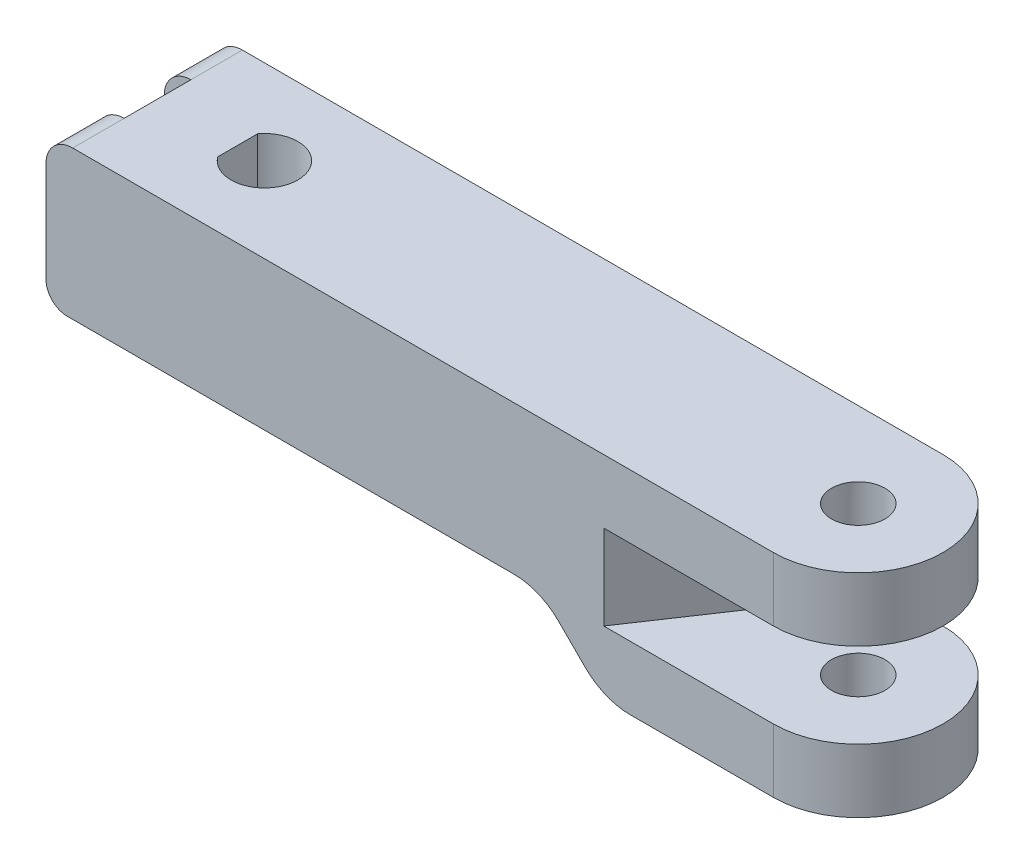
ISO-10303-21;
HEADER;
FILE_DESCRIPTION(('STEP AP214'),'2;1');
FILE_NAME('part.step','',(''),(''),'','','');
FILE_SCHEMA(('AUTOMOTIVE_DESIGN { 1 0 10303 214 1 1 1 1 }'));
ENDSEC;
DATA;
#1=APPLICATION_CONTEXT('core data for automotive mechanical design processes');
#2=APPLICATION_PROTOCOL_DEFINITION('international standard','automotive_design',2000,#1);
#3=PRODUCT_CONTEXT('',#1,'mechanical');
#4=PRODUCT('Part','Part','',(#3));
#5=PRODUCT_RELATED_PRODUCT_CATEGORY('part','',(#4));
#6=PRODUCT_DEFINITION_FORMATION('','',#4);
#7=PRODUCT_DEFINITION_CONTEXT('part definition',#1,'design');
#8=PRODUCT_DEFINITION('design','',#6,#7);
#9=PRODUCT_DEFINITION_SHAPE('','',#8);
#10=(LENGTH_UNIT() NAMED_UNIT(*) SI_UNIT(.MILLI.,.METRE.));
#11=(NAMED_UNIT(*) PLANE_ANGLE_UNIT() SI_UNIT($,.RADIAN.));
#12=(NAMED_UNIT(*) SI_UNIT($,.STERADIAN.) SOLID_ANGLE_UNIT());
#13=UNCERTAINTY_MEASURE_WITH_UNIT(LENGTH_MEASURE(1.E-05),#10,'distance_accuracy_value','');
#14=(GEOMETRIC_REPRESENTATION_CONTEXT(3) GLOBAL_UNCERTAINTY_ASSIGNED_CONTEXT((#13)) GLOBAL_UNIT_ASSIGNED_CONTEXT((#10,
#11,#12)) REPRESENTATION_CONTEXT('',''));
#15=CARTESIAN_POINT('',(0.,0.,0.));
#16=DIRECTION('',(0.,0.,1.));
#17=DIRECTION('',(1.,0.,0.));
#18=AXIS2_PLACEMENT_3D('',#15,#16,#17);
#19=CARTESIAN_POINT('',(0.,0.,-8.85));
#20=DIRECTION('',(0.,0.,1.));
#21=DIRECTION('',(1.,0.,0.));
#22=AXIS2_PLACEMENT_3D('',#19,#20,#21);
#23=PLANE('',#22);
#24=DIRECTION('',(0.,1.,0.));
#25=VECTOR('',#24,1.);
#26=CARTESIAN_POINT('',(2.,-3.1725,-8.85));
#27=LINE('',#26,#25);
#28=CARTESIAN_POINT('',(2.,-3.1725,-8.85));
#29=VERTEX_POINT('',#28);
#30=CARTESIAN_POINT('',(2.,7.9375,-8.85));
#31=VERTEX_POINT('',#30);
#32=EDGE_CURVE('E224',#29,#31,#27,.T.);
#33=ORIENTED_EDGE('',*,*,#32,.T.);
#34=CARTESIAN_POINT('',(2.,5.9375,-8.85));
#35=DIRECTION('',(0.,0.,-1.));
#36=DIRECTION('',(-0.707106781186548,0.707106781186547,0.));
#37=AXIS2_PLACEMENT_3D('',#34,#35,#36);
#38=CIRCLE('',#37,2.);
#39=CARTESIAN_POINT('',(0.,5.9375,-8.85));
#40=VERTEX_POINT('',#39);
#41=EDGE_CURVE('E340',#40,#31,#38,.T.);
#42=ORIENTED_EDGE('',*,*,#41,.F.);
#43=DIRECTION('',(0.,-1.,0.));
#44=VECTOR('',#43,1.);
#45=CARTESIAN_POINT('',(0.,0.,-8.85));
#46=LINE('',#45,#44);
#47=CARTESIAN_POINT('',(0.,-1.5875,-8.85));
#48=VERTEX_POINT('',#47);
#49=EDGE_CURVE('E312',#40,#48,#46,.T.);
#50=ORIENTED_EDGE('',*,*,#49,.T.);
#51=CARTESIAN_POINT('',(1.5875,-1.5875,-8.85));
#52=DIRECTION('',(0.,0.,-1.));
#53=DIRECTION('',(-0.707106781186548,-0.707106781186548,0.));
#54=AXIS2_PLACEMENT_3D('',#51,#52,#53);
#55=CIRCLE('',#54,1.5875);
#56=CARTESIAN_POINT('',(1.5875,-3.175,-8.85));
#57=VERTEX_POINT('',#56);
#58=EDGE_CURVE('E323',#57,#48,#55,.T.);
#59=ORIENTED_EDGE('',*,*,#58,.F.);
#60=DIRECTION('',(-1.,0.,0.));
#61=VECTOR('',#60,1.);
#62=CARTESIAN_POINT('',(0.,-3.175,-8.85));
#63=LINE('',#62,#61);
#64=CARTESIAN_POINT('',(10.,-3.175,-8.85));
#65=VERTEX_POINT('',#64);
#66=EDGE_CURVE('E469',#65,#57,#63,.T.);
#67=ORIENTED_EDGE('',*,*,#66,.F.);
#68=DIRECTION('',(0.,1.,0.));
#69=VECTOR('',#68,1.);
#70=CARTESIAN_POINT('',(10.,0.,-8.85));
#71=LINE('',#70,#69);
#72=CARTESIAN_POINT('',(10.,-3.1725,-8.85));
#73=VERTEX_POINT('',#72);
#74=EDGE_CURVE('E11',#65,#73,#71,.T.);
#75=ORIENTED_EDGE('',*,*,#74,.T.);
#76=DIRECTION('',(1.,0.,0.));
#77=VECTOR('',#76,1.);
#78=CARTESIAN_POINT('',(0.,-3.1725,-8.85));
#79=LINE('',#78,#77);
#80=EDGE_CURVE('E63',#29,#73,#79,.T.);
#81=ORIENTED_EDGE('',*,*,#80,.F.);
#82=EDGE_LOOP('',(#33,#42,#50,#59,#67,#75,#81));
#83=FACE_BOUND('',#82,.T.);
#84=ADVANCED_FACE('F49',(#83),#23,.T.);
#85=CARTESIAN_POINT('',(10.,0.,-6.35));
#86=DIRECTION('',(0.,-1.,0.));
#87=DIRECTION('',(0.,0.,-1.));
#88=AXIS2_PLACEMENT_3D('',#85,#86,#87);
#89=CYLINDRICAL_SURFACE('',#88,2.5);
#90=DIRECTION('',(0.,1.,0.));
#91=VECTOR('',#90,1.);
#92=CARTESIAN_POINT('',(10.,0.,-3.85));
#93=LINE('',#92,#91);
#94=CARTESIAN_POINT('',(10.,-3.175,-3.85));
#95=VERTEX_POINT('',#94);
#96=CARTESIAN_POINT('',(10.,-3.1725,-3.85));
#97=VERTEX_POINT('',#96);
#98=EDGE_CURVE('E57',#95,#97,#93,.T.);
#99=ORIENTED_EDGE('',*,*,#98,.T.);
#100=CARTESIAN_POINT('',(10.,-3.1725,-6.35));
#101=DIRECTION('',(0.,1.,0.));
#102=DIRECTION('',(0.,0.,1.));
#103=AXIS2_PLACEMENT_3D('',#100,#101,#102);
#104=CIRCLE('',#103,2.5);
#105=CARTESIAN_POINT('',(8.,-3.1725,-4.85));
#106=VERTEX_POINT('',#105);
#107=EDGE_CURVE('E218',#106,#97,#104,.T.);
#108=ORIENTED_EDGE('',*,*,#107,.F.);
#109=DIRECTION('',(0.,1.,0.));
#110=VECTOR('',#109,1.);
#111=CARTESIAN_POINT('',(8.,-3.1725,-4.85));
#112=LINE('',#111,#110);
#113=CARTESIAN_POINT('',(8.,7.9375,-4.85));
#114=VERTEX_POINT('',#113);
#115=EDGE_CURVE('E227',#106,#114,#112,.T.);
#116=ORIENTED_EDGE('',*,*,#115,.T.);
#117=CARTESIAN_POINT('',(10.,7.9375,-6.35));
#118=DIRECTION('',(0.,1.,0.));
#119=DIRECTION('',(0.,0.,-1.));
#120=AXIS2_PLACEMENT_3D('',#117,#118,#119);
#121=CIRCLE('',#120,2.5);
#122=CARTESIAN_POINT('',(8.,7.9375,-7.85));
#123=VERTEX_POINT('',#122);
#124=EDGE_CURVE('E374',#114,#123,#121,.T.);
#125=ORIENTED_EDGE('',*,*,#124,.T.);
#126=DIRECTION('',(0.,1.,0.));
#127=VECTOR('',#126,1.);
#128=CARTESIAN_POINT('',(8.,-3.1725,-7.85));
#129=LINE('',#128,#127);
#130=CARTESIAN_POINT('',(8.,-3.1725,-7.85));
#131=VERTEX_POINT('',#130);
#132=EDGE_CURVE('E235',#131,#123,#129,.T.);
#133=ORIENTED_EDGE('',*,*,#132,.F.);
#134=EDGE_CURVE('E220',#73,#131,#104,.T.);
#135=ORIENTED_EDGE('',*,*,#134,.F.);
#136=ORIENTED_EDGE('',*,*,#74,.F.);
#137=CARTESIAN_POINT('',(10.,-3.175,-6.35));
#138=DIRECTION('',(0.,1.,0.));
#139=DIRECTION('',(0.,0.,-1.));
#140=AXIS2_PLACEMENT_3D('',#137,#138,#139);
#141=CIRCLE('',#140,2.5);
#142=EDGE_CURVE('E465',#95,#65,#141,.T.);
#143=ORIENTED_EDGE('',*,*,#142,.F.);
#144=EDGE_LOOP('',(#99,#108,#116,#125,#133,#135,#136,#143));
#145=FACE_BOUND('',#144,.T.);
#146=ADVANCED_FACE('F239',(#145),#89,.F.);
#147=CARTESIAN_POINT('',(10.,0.,-3.85));
#148=DIRECTION('',(0.,0.,-1.));
#149=DIRECTION('',(-1.,0.,0.));
#150=AXIS2_PLACEMENT_3D('',#147,#148,#149);
#151=PLANE('',#150);
#152=DIRECTION('',(0.,1.,0.));
#153=VECTOR('',#152,1.);
#154=CARTESIAN_POINT('',(2.,-3.1725,-3.85));
#155=LINE('',#154,#153);
#156=CARTESIAN_POINT('',(2.,-3.1725,-3.85));
#157=VERTEX_POINT('',#156);
#158=CARTESIAN_POINT('',(2.,7.9375,-3.85));
#159=VERTEX_POINT('',#158);
#160=EDGE_CURVE('E236',#157,#159,#155,.T.);
#161=ORIENTED_EDGE('',*,*,#160,.F.);
#162=DIRECTION('',(-1.,0.,0.));
#163=VECTOR('',#162,1.);
#164=CARTESIAN_POINT('',(0.,-3.1725,-3.85));
#165=LINE('',#164,#163);
#166=EDGE_CURVE('E242',#97,#157,#165,.T.);
#167=ORIENTED_EDGE('',*,*,#166,.F.);
#168=ORIENTED_EDGE('',*,*,#98,.F.);
#169=DIRECTION('',(1.,0.,0.));
#170=VECTOR('',#169,1.);
#171=CARTESIAN_POINT('',(10.,-3.175,-3.85));
#172=LINE('',#171,#170);
#173=CARTESIAN_POINT('',(1.5875,-3.175,-3.85));
#174=VERTEX_POINT('',#173);
#175=EDGE_CURVE('E397',#174,#95,#172,.T.);
#176=ORIENTED_EDGE('',*,*,#175,.F.);
#177=CARTESIAN_POINT('',(1.5875,-1.5875,-3.85));
#178=DIRECTION('',(0.,0.,1.));
#179=DIRECTION('',(-0.707106781186547,-0.707106781186548,0.));
#180=AXIS2_PLACEMENT_3D('',#177,#178,#179);
#181=CIRCLE('',#180,1.5875);
#182=CARTESIAN_POINT('',(0.,-1.5875,-3.85));
#183=VERTEX_POINT('',#182);
#184=EDGE_CURVE('E363',#183,#174,#181,.T.);
#185=ORIENTED_EDGE('',*,*,#184,.F.);
#186=DIRECTION('',(0.,1.,0.));
#187=VECTOR('',#186,1.);
#188=CARTESIAN_POINT('',(0.,0.,-3.85));
#189=LINE('',#188,#187);
#190=CARTESIAN_POINT('',(0.,5.9375,-3.85));
#191=VERTEX_POINT('',#190);
#192=EDGE_CURVE('E330',#183,#191,#189,.T.);
#193=ORIENTED_EDGE('',*,*,#192,.T.);
#194=CARTESIAN_POINT('',(2.,5.9375,-3.85));
#195=DIRECTION('',(0.,0.,1.));
#196=DIRECTION('',(-0.707106781186548,0.707106781186547,0.));
#197=AXIS2_PLACEMENT_3D('',#194,#195,#196);
#198=CIRCLE('',#197,2.);
#199=EDGE_CURVE('E344',#159,#191,#198,.T.);
#200=ORIENTED_EDGE('',*,*,#199,.F.);
#201=EDGE_LOOP('',(#161,#167,#168,#176,#185,#193,#200));
#202=FACE_BOUND('',#201,.T.);
#203=ADVANCED_FACE('F487',(#202),#151,.T.);
#204=CARTESIAN_POINT('',(0.,0.,-3.85));
#205=DIRECTION('',(-1.,0.,0.));
#206=DIRECTION('',(0.,0.,1.));
#207=AXIS2_PLACEMENT_3D('',#204,#205,#206);
#208=PLANE('',#207);
#209=DIRECTION('',(0.,0.,1.));
#210=VECTOR('',#209,1.);
#211=CARTESIAN_POINT('',(0.,5.9375,-5.1));
#212=LINE('',#211,#210);
#213=CARTESIAN_POINT('',(0.,5.9375,0.));
#214=VERTEX_POINT('',#213);
#215=EDGE_CURVE('E443',#191,#214,#212,.T.);
#216=ORIENTED_EDGE('',*,*,#215,.F.);
#217=ORIENTED_EDGE('',*,*,#192,.F.);
#218=DIRECTION('',(0.,0.,-1.));
#219=VECTOR('',#218,1.);
#220=CARTESIAN_POINT('',(0.,-1.5875,-5.1));
#221=LINE('',#220,#219);
#222=CARTESIAN_POINT('',(0.,-1.5875,0.));
#223=VERTEX_POINT('',#222);
#224=EDGE_CURVE('E315',#223,#183,#221,.T.);
#225=ORIENTED_EDGE('',*,*,#224,.F.);
#226=DIRECTION('',(0.,1.,0.));
#227=VECTOR('',#226,1.);
#228=CARTESIAN_POINT('',(0.,0.,0.));
#229=LINE('',#228,#227);
#230=EDGE_CURVE('E405',#223,#214,#229,.T.);
#231=ORIENTED_EDGE('',*,*,#230,.T.);
#232=EDGE_LOOP('',(#216,#217,#225,#231));
#233=FACE_BOUND('',#232,.T.);
#234=ADVANCED_FACE('F490',(#233),#208,.T.);
#235=CARTESIAN_POINT('',(1.5875,-1.5875,-5.1));
#236=DIRECTION('',(0.,0.,1.));
#237=DIRECTION('',(-0.707106781186547,-0.707106781186548,0.));
#238=AXIS2_PLACEMENT_3D('',#235,#236,#237);
#239=CYLINDRICAL_SURFACE('',#238,1.5875);
#240=CARTESIAN_POINT('',(1.5875,-1.5875,0.));
#241=DIRECTION('',(0.,0.,-1.));
#242=DIRECTION('',(-0.707106781186547,-0.707106781186548,0.));
#243=AXIS2_PLACEMENT_3D('',#240,#241,#242);
#244=CIRCLE('',#243,1.5875);
#245=CARTESIAN_POINT('',(1.5875,-3.175,0.));
#246=VERTEX_POINT('',#245);
#247=EDGE_CURVE('E409',#246,#223,#244,.T.);
#248=ORIENTED_EDGE('',*,*,#247,.T.);
#249=ORIENTED_EDGE('',*,*,#224,.T.);
#250=ORIENTED_EDGE('',*,*,#184,.T.);
#251=DIRECTION('',(0.,0.,1.));
#252=VECTOR('',#251,1.);
#253=CARTESIAN_POINT('',(1.5875,-3.175,-5.1));
#254=LINE('',#253,#252);
#255=EDGE_CURVE('E394',#174,#246,#254,.T.);
#256=ORIENTED_EDGE('',*,*,#255,.T.);
#257=EDGE_LOOP('',(#248,#249,#250,#256));
#258=FACE_BOUND('',#257,.T.);
#259=ADVANCED_FACE('F518',(#258),#239,.T.);
#260=CARTESIAN_POINT('',(0.,0.,-12.7));
#261=DIRECTION('',(-1.,0.,0.));
#262=DIRECTION('',(0.,0.,1.));
#263=AXIS2_PLACEMENT_3D('',#260,#261,#262);
#264=PLANE('',#263);
#265=DIRECTION('',(0.,0.,1.));
#266=VECTOR('',#265,1.);
#267=CARTESIAN_POINT('',(0.,5.9375,-9.525));
#268=LINE('',#267,#266);
#269=CARTESIAN_POINT('',(0.,5.9375,-12.7));
#270=VERTEX_POINT('',#269);
#271=EDGE_CURVE('E345',#270,#40,#268,.T.);
#272=ORIENTED_EDGE('',*,*,#271,.F.);
#273=DIRECTION('',(0.,1.,0.));
#274=VECTOR('',#273,1.);
#275=CARTESIAN_POINT('',(0.,0.,-12.7));
#276=LINE('',#275,#274);
#277=CARTESIAN_POINT('',(0.,-1.5875,-12.7));
#278=VERTEX_POINT('',#277);
#279=EDGE_CURVE('E281',#278,#270,#276,.T.);
#280=ORIENTED_EDGE('',*,*,#279,.F.);
#281=DIRECTION('',(0.,0.,-1.));
#282=VECTOR('',#281,1.);
#283=CARTESIAN_POINT('',(0.,-1.5875,-9.525));
#284=LINE('',#283,#282);
#285=EDGE_CURVE('E316',#48,#278,#284,.T.);
#286=ORIENTED_EDGE('',*,*,#285,.F.);
#287=ORIENTED_EDGE('',*,*,#49,.F.);
#288=EDGE_LOOP('',(#272,#280,#286,#287));
#289=FACE_BOUND('',#288,.T.);
#290=ADVANCED_FACE('F533',(#289),#264,.T.);
#291=CARTESIAN_POINT('',(1.5875,-1.5875,-9.525));
#292=DIRECTION('',(0.,0.,1.));
#293=DIRECTION('',(-0.707106781186548,-0.707106781186548,0.));
#294=AXIS2_PLACEMENT_3D('',#291,#292,#293);
#295=CYLINDRICAL_SURFACE('',#294,1.5875);
#296=CARTESIAN_POINT('',(1.5875,-1.5875,-12.7));
#297=DIRECTION('',(0.,0.,1.));
#298=DIRECTION('',(-0.707106781186548,-0.707106781186548,0.));
#299=AXIS2_PLACEMENT_3D('',#296,#297,#298);
#300=CIRCLE('',#299,1.5875);
#301=CARTESIAN_POINT('',(1.5875,-3.175,-12.7));
#302=VERTEX_POINT('',#301);
#303=EDGE_CURVE('E286',#278,#302,#300,.T.);
#304=ORIENTED_EDGE('',*,*,#303,.T.);
#305=DIRECTION('',(0.,0.,1.));
#306=VECTOR('',#305,1.);
#307=CARTESIAN_POINT('',(1.5875,-3.175,-9.525));
#308=LINE('',#307,#306);
#309=EDGE_CURVE('E324',#302,#57,#308,.T.);
#310=ORIENTED_EDGE('',*,*,#309,.T.);
#311=ORIENTED_EDGE('',*,*,#58,.T.);
#312=ORIENTED_EDGE('',*,*,#285,.T.);
#313=EDGE_LOOP('',(#304,#310,#311,#312));
#314=FACE_BOUND('',#313,.T.);
#315=ADVANCED_FACE('F535',(#314),#295,.T.);
#316=CARTESIAN_POINT('',(39.36875,-5.55625,-9.525));
#317=DIRECTION('',(-0.707106781186548,-0.707106781186548,0.));
#318=DIRECTION('',(0.,0.,1.));
#319=AXIS2_PLACEMENT_3D('',#316,#317,#318);
#320=PLANE('',#319);
#321=DIRECTION('',(0.,0.,1.));
#322=VECTOR('',#321,1.);
#323=CARTESIAN_POINT('',(38.382403954599,-4.56990395459907,-7.9375));
#324=LINE('',#323,#322);
#325=CARTESIAN_POINT('',(38.382403954599,-4.56990395459907,-12.7));
#326=VERTEX_POINT('',#325);
#327=CARTESIAN_POINT('',(38.382403954599,-4.56990395459907,0.));
#328=VERTEX_POINT('',#327);
#329=EDGE_CURVE('E385',#326,#328,#324,.T.);
#330=ORIENTED_EDGE('',*,*,#329,.F.);
#331=DIRECTION('',(0.707106781186548,-0.707106781186548,0.));
#332=VECTOR('',#331,1.);
#333=CARTESIAN_POINT('',(43.3375,-9.525,-12.7));
#334=LINE('',#333,#332);
#335=CARTESIAN_POINT('',(40.3550960454009,-6.54259604540093,-12.7));
#336=VERTEX_POINT('',#335);
#337=EDGE_CURVE('E287',#326,#336,#334,.T.);
#338=ORIENTED_EDGE('',*,*,#337,.T.);
#339=DIRECTION('',(0.,0.,-1.));
#340=VECTOR('',#339,1.);
#341=CARTESIAN_POINT('',(40.3550960454009,-6.54259604540093,-7.9375));
#342=LINE('',#341,#340);
#343=CARTESIAN_POINT('',(40.3550960454009,-6.54259604540093,0.));
#344=VERTEX_POINT('',#343);
#345=EDGE_CURVE('E320',#344,#336,#342,.T.);
#346=ORIENTED_EDGE('',*,*,#345,.F.);
#347=DIRECTION('',(-0.707106781186548,0.707106781186548,0.));
#348=VECTOR('',#347,1.);
#349=CARTESIAN_POINT('',(28.1375,5.675,0.));
#350=LINE('',#349,#348);
#351=EDGE_CURVE('E421',#344,#328,#350,.T.);
#352=ORIENTED_EDGE('',*,*,#351,.T.);
#353=EDGE_LOOP('',(#330,#338,#346,#352));
#354=FACE_BOUND('',#353,.T.);
#355=ADVANCED_FACE('F546',(#354),#320,.T.);
#356=CARTESIAN_POINT('',(43.7226920908018,-3.175,-7.9375));
#357=DIRECTION('',(0.,0.,1.));
#358=DIRECTION('',(-0.38268343236509,-0.923879532511287,0.));
#359=AXIS2_PLACEMENT_3D('',#356,#357,#358);
#360=CYLINDRICAL_SURFACE('',#359,4.7625);
#361=CARTESIAN_POINT('',(43.7226920908018,-3.175,-12.7));
#362=DIRECTION('',(0.,0.,1.));
#363=DIRECTION('',(-0.38268343236509,-0.923879532511287,0.));
#364=AXIS2_PLACEMENT_3D('',#361,#362,#363);
#365=CIRCLE('',#364,4.7625);
#366=CARTESIAN_POINT('',(43.7226920908018,-7.9375,-12.7));
#367=VERTEX_POINT('',#366);
#368=EDGE_CURVE('E292',#336,#367,#365,.T.);
#369=ORIENTED_EDGE('',*,*,#368,.T.);
#370=DIRECTION('',(0.,0.,1.));
#371=VECTOR('',#370,1.);
#372=CARTESIAN_POINT('',(43.7226920908018,-7.9375,-7.9375));
#373=LINE('',#372,#371);
#374=CARTESIAN_POINT('',(43.7226920908018,-7.9375,0.));
#375=VERTEX_POINT('',#374);
#376=EDGE_CURVE('E455',#367,#375,#373,.T.);
#377=ORIENTED_EDGE('',*,*,#376,.T.);
#378=CARTESIAN_POINT('',(43.7226920908018,-3.175,0.));
#379=DIRECTION('',(0.,0.,-1.));
#380=DIRECTION('',(-0.38268343236509,-0.923879532511287,0.));
#381=AXIS2_PLACEMENT_3D('',#378,#379,#380);
#382=CIRCLE('',#381,4.7625);
#383=EDGE_CURVE('E425',#375,#344,#382,.T.);
#384=ORIENTED_EDGE('',*,*,#383,.T.);
#385=ORIENTED_EDGE('',*,*,#345,.T.);
#386=EDGE_LOOP('',(#369,#377,#384,#385));
#387=FACE_BOUND('',#386,.T.);
#388=ADVANCED_FACE('F548',(#387),#360,.T.);
#389=CARTESIAN_POINT('',(30.4,-3.175,-6.35));
#390=DIRECTION('',(0.,1.,0.));
#391=DIRECTION('',(0.,0.,1.));
#392=AXIS2_PLACEMENT_3D('',#389,#390,#391);
#393=PLANE('',#392);
#394=DIRECTION('',(0.,0.,-1.));
#395=VECTOR('',#394,1.);
#396=CARTESIAN_POINT('',(35.0148079091981,-3.175,-7.9375));
#397=LINE('',#396,#395);
#398=CARTESIAN_POINT('',(35.0148079091981,-3.175,0.));
#399=VERTEX_POINT('',#398);
#400=CARTESIAN_POINT('',(35.0148079091981,-3.175,-12.7));
#401=VERTEX_POINT('',#400);
#402=EDGE_CURVE('E382',#399,#401,#397,.T.);
#403=ORIENTED_EDGE('',*,*,#402,.F.);
#404=DIRECTION('',(-1.,0.,0.));
#405=VECTOR('',#404,1.);
#406=CARTESIAN_POINT('',(0.,-3.175,0.));
#407=LINE('',#406,#405);
#408=EDGE_CURVE('E413',#399,#246,#407,.T.);
#409=ORIENTED_EDGE('',*,*,#408,.T.);
#410=ORIENTED_EDGE('',*,*,#255,.F.);
#411=ORIENTED_EDGE('',*,*,#175,.T.);
#412=ORIENTED_EDGE('',*,*,#142,.T.);
#413=ORIENTED_EDGE('',*,*,#66,.T.);
#414=ORIENTED_EDGE('',*,*,#309,.F.);
#415=DIRECTION('',(1.,0.,0.));
#416=VECTOR('',#415,1.);
#417=CARTESIAN_POINT('',(60.8,-3.175,-12.7));
#418=LINE('',#417,#416);
#419=EDGE_CURVE('E304',#302,#401,#418,.T.);
#420=ORIENTED_EDGE('',*,*,#419,.T.);
#421=EDGE_LOOP('',(#403,#409,#410,#411,#412,#413,#414,#420));
#422=FACE_BOUND('',#421,.T.);
#423=ADVANCED_FACE('F514',(#422),#393,.F.);
#424=CARTESIAN_POINT('',(35.0148079091981,-7.9375,-7.9375));
#425=DIRECTION('',(0.,0.,1.));
#426=DIRECTION('',(0.38268343236509,0.923879532511287,0.));
#427=AXIS2_PLACEMENT_3D('',#424,#425,#426);
#428=CYLINDRICAL_SURFACE('',#427,4.7625);
#429=CARTESIAN_POINT('',(35.0148079091981,-7.9375,0.));
#430=DIRECTION('',(0.,0.,1.));
#431=DIRECTION('',(0.38268343236509,0.923879532511287,0.));
#432=AXIS2_PLACEMENT_3D('',#429,#430,#431);
#433=CIRCLE('',#432,4.7625);
#434=EDGE_CURVE('E417',#328,#399,#433,.T.);
#435=ORIENTED_EDGE('',*,*,#434,.T.);
#436=ORIENTED_EDGE('',*,*,#402,.T.);
#437=CARTESIAN_POINT('',(35.0148079091981,-7.9375,-12.7));
#438=DIRECTION('',(0.,0.,-1.));
#439=DIRECTION('',(0.38268343236509,0.923879532511287,0.));
#440=AXIS2_PLACEMENT_3D('',#437,#438,#439);
#441=CIRCLE('',#440,4.7625);
#442=EDGE_CURVE('E291',#401,#326,#441,.T.);
#443=ORIENTED_EDGE('',*,*,#442,.T.);
#444=ORIENTED_EDGE('',*,*,#329,.T.);
#445=EDGE_LOOP('',(#435,#436,#443,#444));
#446=FACE_BOUND('',#445,.T.);
#447=ADVANCED_FACE('F540',(#446),#428,.F.);
#448=CARTESIAN_POINT('',(54.45,0.,-6.35));
#449=DIRECTION('',(0.,-1.,0.));
#450=DIRECTION('',(0.707106781186548,0.,0.707106781186548));
#451=AXIS2_PLACEMENT_3D('',#448,#449,#450);
#452=CYLINDRICAL_SURFACE('',#451,6.35);
#453=CARTESIAN_POINT('',(54.45,7.9375,-6.35));
#454=DIRECTION('',(0.,-1.,0.));
#455=DIRECTION('',(0.707106781186548,0.,-0.707106781186548));
#456=AXIS2_PLACEMENT_3D('',#453,#454,#455);
#457=CIRCLE('',#456,6.35);
#458=CARTESIAN_POINT('',(54.45,7.9375,-12.7));
#459=VERTEX_POINT('',#458);
#460=CARTESIAN_POINT('',(54.45,7.9375,0.));
#461=VERTEX_POINT('',#460);
#462=EDGE_CURVE('E367',#459,#461,#457,.T.);
#463=ORIENTED_EDGE('',*,*,#462,.T.);
#464=DIRECTION('',(0.,-1.,0.));
#465=VECTOR('',#464,1.);
#466=CARTESIAN_POINT('',(54.45,0.,0.));
#467=LINE('',#466,#465);
#468=CARTESIAN_POINT('',(54.45,3.175,0.));
#469=VERTEX_POINT('',#468);
#470=EDGE_CURVE('E265',#461,#469,#467,.T.);
#471=ORIENTED_EDGE('',*,*,#470,.T.);
#472=CARTESIAN_POINT('',(54.45,3.175,-6.35));
#473=DIRECTION('',(0.,1.,0.));
#474=DIRECTION('',(0.707106781186548,0.,-0.707106781186548));
#475=AXIS2_PLACEMENT_3D('',#472,#473,#474);
#476=CIRCLE('',#475,6.35);
#477=CARTESIAN_POINT('',(54.45,3.175,-12.7));
#478=VERTEX_POINT('',#477);
#479=EDGE_CURVE('E386',#469,#478,#476,.T.);
#480=ORIENTED_EDGE('',*,*,#479,.T.);
#481=DIRECTION('',(0.,1.,0.));
#482=VECTOR('',#481,1.);
#483=CARTESIAN_POINT('',(54.45,0.,-12.7));
#484=LINE('',#483,#482);
#485=EDGE_CURVE('E280',#478,#459,#484,.T.);
#486=ORIENTED_EDGE('',*,*,#485,.T.);
#487=EDGE_LOOP('',(#463,#471,#480,#486));
#488=FACE_BOUND('',#487,.T.);
#489=ADVANCED_FACE('F523',(#488),#452,.T.);
#490=CARTESIAN_POINT('',(41.75,3.175,0.));
#491=DIRECTION('',(0.,1.,0.));
#492=DIRECTION('',(1.,0.,0.));
#493=AXIS2_PLACEMENT_3D('',#490,#491,#492);
#494=PLANE('',#493);
#495=CARTESIAN_POINT('',(54.45,3.175,-6.35));
#496=DIRECTION('',(0.,1.,0.));
#497=DIRECTION('',(1.,0.,0.));
#498=AXIS2_PLACEMENT_3D('',#495,#496,#497);
#499=CIRCLE('',#498,2.);
#500=CARTESIAN_POINT('',(52.45,3.175,-6.35));
#501=VERTEX_POINT('',#500);
#502=EDGE_CURVE('E446',#501,#501,#499,.T.);
#503=ORIENTED_EDGE('',*,*,#502,.T.);
#504=EDGE_LOOP('',(#503));
#505=FACE_BOUND('',#504,.T.);
#506=DIRECTION('',(0.557337622445935,0.,-0.830285959538226));
#507=VECTOR('',#506,1.);
#508=CARTESIAN_POINT('',(41.75,3.175,0.));
#509=LINE('',#508,#507);
#510=CARTESIAN_POINT('',(41.75,3.175,0.));
#511=VERTEX_POINT('',#510);
#512=CARTESIAN_POINT('',(50.275,3.175,-12.7));
#513=VERTEX_POINT('',#512);
#514=EDGE_CURVE('E279',#511,#513,#509,.T.);
#515=ORIENTED_EDGE('',*,*,#514,.T.);
#516=DIRECTION('',(-1.,0.,0.));
#517=VECTOR('',#516,1.);
#518=CARTESIAN_POINT('',(51.275,3.175,-12.7));
#519=LINE('',#518,#517);
#520=EDGE_CURVE('E275',#478,#513,#519,.T.);
#521=ORIENTED_EDGE('',*,*,#520,.F.);
#522=ORIENTED_EDGE('',*,*,#479,.F.);
#523=DIRECTION('',(1.,0.,0.));
#524=VECTOR('',#523,1.);
#525=CARTESIAN_POINT('',(20.875,3.175,0.));
#526=LINE('',#525,#524);
#527=EDGE_CURVE('E270',#511,#469,#526,.T.);
#528=ORIENTED_EDGE('',*,*,#527,.F.);
#529=EDGE_LOOP('',(#515,#521,#522,#528));
#530=FACE_BOUND('',#529,.T.);
#531=ADVANCED_FACE('F565',(#505,#530),#494,.F.);
#532=CARTESIAN_POINT('',(54.45,0.,-6.35));
#533=DIRECTION('',(0.,-1.,0.));
#534=DIRECTION('',(0.707106781186548,0.,0.707106781186548));
#535=AXIS2_PLACEMENT_3D('',#532,#533,#534);
#536=CYLINDRICAL_SURFACE('',#535,6.35);
#537=CARTESIAN_POINT('',(54.45,-3.175,-6.35));
#538=DIRECTION('',(0.,-1.,0.));
#539=DIRECTION('',(0.707106781186548,0.,0.707106781186548));
#540=AXIS2_PLACEMENT_3D('',#537,#538,#539);
#541=CIRCLE('',#540,6.35);
#542=CARTESIAN_POINT('',(54.45,-3.175,-12.7));
#543=VERTEX_POINT('',#542);
#544=CARTESIAN_POINT('',(54.45,-3.175,0.));
#545=VERTEX_POINT('',#544);
#546=EDGE_CURVE('E389',#543,#545,#541,.T.);
#547=ORIENTED_EDGE('',*,*,#546,.T.);
#548=DIRECTION('',(0.,-1.,0.));
#549=VECTOR('',#548,1.);
#550=CARTESIAN_POINT('',(54.45,0.,0.));
#551=LINE('',#550,#549);
#552=CARTESIAN_POINT('',(54.45,-7.9375,0.));
#553=VERTEX_POINT('',#552);
#554=EDGE_CURVE('E433',#545,#553,#551,.T.);
#555=ORIENTED_EDGE('',*,*,#554,.T.);
#556=CARTESIAN_POINT('',(54.45,-7.9375,-6.35));
#557=DIRECTION('',(0.,1.,0.));
#558=DIRECTION('',(0.707106781186548,0.,-0.707106781186548));
#559=AXIS2_PLACEMENT_3D('',#556,#557,#558);
#560=CIRCLE('',#559,6.35);
#561=CARTESIAN_POINT('',(54.45,-7.9375,-12.7));
#562=VERTEX_POINT('',#561);
#563=EDGE_CURVE('E452',#553,#562,#560,.T.);
#564=ORIENTED_EDGE('',*,*,#563,.T.);
#565=DIRECTION('',(0.,1.,0.));
#566=VECTOR('',#565,1.);
#567=CARTESIAN_POINT('',(54.45,0.,-12.7));
#568=LINE('',#567,#566);
#569=EDGE_CURVE('E296',#562,#543,#568,.T.);
#570=ORIENTED_EDGE('',*,*,#569,.T.);
#571=EDGE_LOOP('',(#547,#555,#564,#570));
#572=FACE_BOUND('',#571,.T.);
#573=ADVANCED_FACE('F555',(#572),#536,.T.);
#574=CARTESIAN_POINT('',(51.275,-7.9375,-6.35));
#575=DIRECTION('',(0.,-1.,0.));
#576=DIRECTION('',(0.,0.,-1.));
#577=AXIS2_PLACEMENT_3D('',#574,#575,#576);
#578=PLANE('',#577);
#579=ORIENTED_EDGE('',*,*,#563,.F.);
#580=DIRECTION('',(-1.,0.,0.));
#581=VECTOR('',#580,1.);
#582=CARTESIAN_POINT('',(0.,-7.9375,0.));
#583=LINE('',#582,#581);
#584=EDGE_CURVE('E429',#553,#375,#583,.T.);
#585=ORIENTED_EDGE('',*,*,#584,.T.);
#586=ORIENTED_EDGE('',*,*,#376,.F.);
#587=DIRECTION('',(1.,0.,0.));
#588=VECTOR('',#587,1.);
#589=CARTESIAN_POINT('',(60.8,-7.9375,-12.7));
#590=LINE('',#589,#588);
#591=EDGE_CURVE('E308',#367,#562,#590,.T.);
#592=ORIENTED_EDGE('',*,*,#591,.T.);
#593=EDGE_LOOP('',(#579,#585,#586,#592));
#594=FACE_BOUND('',#593,.T.);
#595=CARTESIAN_POINT('',(54.45,-7.9375,-6.35));
#596=DIRECTION('',(0.,1.,0.));
#597=DIRECTION('',(1.,0.,0.));
#598=AXIS2_PLACEMENT_3D('',#595,#596,#597);
#599=CIRCLE('',#598,2.);
#600=CARTESIAN_POINT('',(52.45,-7.9375,-6.35));
#601=VERTEX_POINT('',#600);
#602=EDGE_CURVE('E449',#601,#601,#599,.T.);
#603=ORIENTED_EDGE('',*,*,#602,.T.);
#604=EDGE_LOOP('',(#603));
#605=FACE_BOUND('',#604,.T.);
#606=ADVANCED_FACE('F551',(#594,#605),#578,.T.);
#607=CARTESIAN_POINT('',(54.45,-56.1713576173371,-6.35));
#608=DIRECTION('',(0.,-1.,0.));
#609=DIRECTION('',(1.,0.,0.));
#610=AXIS2_PLACEMENT_3D('',#607,#608,#609);
#611=CYLINDRICAL_SURFACE('',#610,2.);
#612=CARTESIAN_POINT('',(54.45,-3.175,-6.35));
#613=DIRECTION('',(0.,-1.,0.));
#614=DIRECTION('',(1.,0.,0.));
#615=AXIS2_PLACEMENT_3D('',#612,#613,#614);
#616=CIRCLE('',#615,2.);
#617=CARTESIAN_POINT('',(52.45,-3.175,-6.35));
#618=VERTEX_POINT('',#617);
#619=EDGE_CURVE('E393',#618,#618,#616,.T.);
#620=ORIENTED_EDGE('',*,*,#619,.F.);
#621=EDGE_LOOP('',(#620));
#622=FACE_BOUND('',#621,.T.);
#623=ORIENTED_EDGE('',*,*,#602,.F.);
#624=EDGE_LOOP('',(#623));
#625=FACE_BOUND('',#624,.T.);
#626=ADVANCED_FACE('F616',(#622,#625),#611,.F.);
#627=CARTESIAN_POINT('',(54.45,-56.1713576173371,-6.35));
#628=DIRECTION('',(0.,-1.,0.));
#629=DIRECTION('',(1.,0.,0.));
#630=AXIS2_PLACEMENT_3D('',#627,#628,#629);
#631=CYLINDRICAL_SURFACE('',#630,2.);
#632=ORIENTED_EDGE('',*,*,#502,.F.);
#633=EDGE_LOOP('',(#632));
#634=FACE_BOUND('',#633,.T.);
#635=CARTESIAN_POINT('',(54.45,7.9375,-6.35));
#636=DIRECTION('',(0.,-1.,0.));
#637=DIRECTION('',(1.,0.,0.));
#638=AXIS2_PLACEMENT_3D('',#635,#636,#637);
#639=CIRCLE('',#638,2.);
#640=CARTESIAN_POINT('',(56.45,7.9375,-6.35));
#641=VERTEX_POINT('',#640);
#642=EDGE_CURVE('E356',#641,#641,#639,.T.);
#643=ORIENTED_EDGE('',*,*,#642,.F.);
#644=EDGE_LOOP('',(#643));
#645=FACE_BOUND('',#644,.T.);
#646=ADVANCED_FACE('F614',(#634,#645),#631,.F.);
#647=CARTESIAN_POINT('',(2.,5.9375,-5.1));
#648=DIRECTION('',(0.,0.,1.));
#649=DIRECTION('',(-0.707106781186548,0.707106781186547,0.));
#650=AXIS2_PLACEMENT_3D('',#647,#648,#649);
#651=CYLINDRICAL_SURFACE('',#650,2.);
#652=CARTESIAN_POINT('',(2.,5.9375,0.));
#653=DIRECTION('',(0.,0.,-1.));
#654=DIRECTION('',(-0.707106781186548,0.707106781186547,0.));
#655=AXIS2_PLACEMENT_3D('',#652,#653,#654);
#656=CIRCLE('',#655,2.);
#657=CARTESIAN_POINT('',(2.,7.9375,0.));
#658=VERTEX_POINT('',#657);
#659=EDGE_CURVE('E269',#214,#658,#656,.T.);
#660=ORIENTED_EDGE('',*,*,#659,.T.);
#661=DIRECTION('',(0.,0.,-1.));
#662=VECTOR('',#661,1.);
#663=CARTESIAN_POINT('',(2.,7.9375,-5.1));
#664=LINE('',#663,#662);
#665=EDGE_CURVE('E377',#658,#159,#664,.T.);
#666=ORIENTED_EDGE('',*,*,#665,.T.);
#667=ORIENTED_EDGE('',*,*,#199,.T.);
#668=ORIENTED_EDGE('',*,*,#215,.T.);
#669=EDGE_LOOP('',(#660,#666,#667,#668));
#670=FACE_BOUND('',#669,.T.);
#671=ADVANCED_FACE('F494',(#670),#651,.T.);
#672=CARTESIAN_POINT('',(2.,5.9375,-9.525));
#673=DIRECTION('',(0.,0.,1.));
#674=DIRECTION('',(-0.707106781186548,0.707106781186547,0.));
#675=AXIS2_PLACEMENT_3D('',#672,#673,#674);
#676=CYLINDRICAL_SURFACE('',#675,2.);
#677=CARTESIAN_POINT('',(2.,5.9375,-12.7));
#678=DIRECTION('',(0.,0.,1.));
#679=DIRECTION('',(-0.707106781186548,0.707106781186547,0.));
#680=AXIS2_PLACEMENT_3D('',#677,#678,#679);
#681=CIRCLE('',#680,2.);
#682=CARTESIAN_POINT('',(2.,7.9375,-12.7));
#683=VERTEX_POINT('',#682);
#684=EDGE_CURVE('E285',#683,#270,#681,.T.);
#685=ORIENTED_EDGE('',*,*,#684,.T.);
#686=ORIENTED_EDGE('',*,*,#271,.T.);
#687=ORIENTED_EDGE('',*,*,#41,.T.);
#688=DIRECTION('',(0.,0.,-1.));
#689=VECTOR('',#688,1.);
#690=CARTESIAN_POINT('',(2.,7.9375,-9.525));
#691=LINE('',#690,#689);
#692=EDGE_CURVE('E371',#31,#683,#691,.T.);
#693=ORIENTED_EDGE('',*,*,#692,.T.);
#694=EDGE_LOOP('',(#685,#686,#687,#693));
#695=FACE_BOUND('',#694,.T.);
#696=ADVANCED_FACE('F509',(#695),#676,.T.);
#697=CARTESIAN_POINT('',(0.,0.,0.));
#698=DIRECTION('',(0.,0.,1.));
#699=DIRECTION('',(1.,0.,0.));
#700=AXIS2_PLACEMENT_3D('',#697,#698,#699);
#701=PLANE('',#700);
#702=ORIENTED_EDGE('',*,*,#527,.T.);
#703=ORIENTED_EDGE('',*,*,#470,.F.);
#704=DIRECTION('',(-1.,0.,0.));
#705=VECTOR('',#704,1.);
#706=CARTESIAN_POINT('',(10.4375,7.9375,0.));
#707=LINE('',#706,#705);
#708=EDGE_CURVE('E359',#461,#658,#707,.T.);
#709=ORIENTED_EDGE('',*,*,#708,.T.);
#710=ORIENTED_EDGE('',*,*,#659,.F.);
#711=ORIENTED_EDGE('',*,*,#230,.F.);
#712=ORIENTED_EDGE('',*,*,#247,.F.);
#713=ORIENTED_EDGE('',*,*,#408,.F.);
#714=ORIENTED_EDGE('',*,*,#434,.F.);
#715=ORIENTED_EDGE('',*,*,#351,.F.);
#716=ORIENTED_EDGE('',*,*,#383,.F.);
#717=ORIENTED_EDGE('',*,*,#584,.F.);
#718=ORIENTED_EDGE('',*,*,#554,.F.);
#719=DIRECTION('',(-1.,0.,0.));
#720=VECTOR('',#719,1.);
#721=CARTESIAN_POINT('',(30.4,-3.175,0.));
#722=LINE('',#721,#720);
#723=CARTESIAN_POINT('',(41.75,-3.175,0.));
#724=VERTEX_POINT('',#723);
#725=EDGE_CURVE('E381',#545,#724,#722,.T.);
#726=ORIENTED_EDGE('',*,*,#725,.T.);
#727=DIRECTION('',(0.,1.,0.));
#728=VECTOR('',#727,1.);
#729=CARTESIAN_POINT('',(41.75,-1.5875,0.));
#730=LINE('',#729,#728);
#731=EDGE_CURVE('E348',#724,#511,#730,.T.);
#732=ORIENTED_EDGE('',*,*,#731,.T.);
#733=EDGE_LOOP('',(#702,#703,#709,#710,#711,#712,#713,#714,#715,#716,#717,#718,#726,#732));
#734=FACE_BOUND('',#733,.T.);
#735=ADVANCED_FACE('F520',(#734),#701,.T.);
#736=CARTESIAN_POINT('',(60.8,-3.175,0.));
#737=DIRECTION('',(0.,-1.,0.));
#738=DIRECTION('',(-1.,0.,0.));
#739=AXIS2_PLACEMENT_3D('',#736,#737,#738);
#740=PLANE('',#739);
#741=ORIENTED_EDGE('',*,*,#619,.T.);
#742=EDGE_LOOP('',(#741));
#743=FACE_BOUND('',#742,.T.);
#744=DIRECTION('',(-0.557337622445935,0.,0.830285959538226));
#745=VECTOR('',#744,1.);
#746=CARTESIAN_POINT('',(44.7087052718748,-3.175,-4.40768996513911));
#747=LINE('',#746,#745);
#748=CARTESIAN_POINT('',(50.275,-3.175,-12.7));
#749=VERTEX_POINT('',#748);
#750=EDGE_CURVE('E352',#749,#724,#747,.T.);
#751=ORIENTED_EDGE('',*,*,#750,.T.);
#752=ORIENTED_EDGE('',*,*,#725,.F.);
#753=ORIENTED_EDGE('',*,*,#546,.F.);
#754=DIRECTION('',(1.,0.,0.));
#755=VECTOR('',#754,1.);
#756=CARTESIAN_POINT('',(60.8,-3.175,-12.7));
#757=LINE('',#756,#755);
#758=EDGE_CURVE('E274',#749,#543,#757,.T.);
#759=ORIENTED_EDGE('',*,*,#758,.F.);
#760=EDGE_LOOP('',(#751,#752,#753,#759));
#761=FACE_BOUND('',#760,.T.);
#762=ADVANCED_FACE('F559',(#743,#761),#740,.F.);
#763=CARTESIAN_POINT('',(51.275,7.9375,-6.35));
#764=DIRECTION('',(0.,1.,0.));
#765=DIRECTION('',(0.,0.,1.));
#766=AXIS2_PLACEMENT_3D('',#763,#764,#765);
#767=PLANE('',#766);
#768=ORIENTED_EDGE('',*,*,#124,.F.);
#769=DIRECTION('',(0.,0.,1.));
#770=VECTOR('',#769,1.);
#771=CARTESIAN_POINT('',(8.,7.9375,0.));
#772=LINE('',#771,#770);
#773=EDGE_CURVE('E230',#123,#114,#772,.T.);
#774=ORIENTED_EDGE('',*,*,#773,.F.);
#775=EDGE_LOOP('',(#768,#774));
#776=FACE_BOUND('',#775,.T.);
#777=ORIENTED_EDGE('',*,*,#708,.F.);
#778=ORIENTED_EDGE('',*,*,#462,.F.);
#779=DIRECTION('',(-1.,0.,0.));
#780=VECTOR('',#779,1.);
#781=CARTESIAN_POINT('',(60.8,7.9375,-12.7));
#782=LINE('',#781,#780);
#783=EDGE_CURVE('E300',#459,#683,#782,.T.);
#784=ORIENTED_EDGE('',*,*,#783,.T.);
#785=ORIENTED_EDGE('',*,*,#692,.F.);
#786=DIRECTION('',(0.,0.,1.));
#787=VECTOR('',#786,1.);
#788=CARTESIAN_POINT('',(2.,7.9375,0.));
#789=LINE('',#788,#787);
#790=EDGE_CURVE('E251',#31,#159,#789,.T.);
#791=ORIENTED_EDGE('',*,*,#790,.T.);
#792=ORIENTED_EDGE('',*,*,#665,.F.);
#793=EDGE_LOOP('',(#777,#778,#784,#785,#791,#792));
#794=FACE_BOUND('',#793,.T.);
#795=ORIENTED_EDGE('',*,*,#642,.T.);
#796=EDGE_LOOP('',(#795));
#797=FACE_BOUND('',#796,.T.);
#798=ADVANCED_FACE('F503',(#776,#794,#797),#767,.T.);
#799=CARTESIAN_POINT('',(41.75,-3.175,0.));
#800=DIRECTION('',(0.830285959538226,0.,0.557337622445935));
#801=DIRECTION('',(0.557337622445935,0.,-0.830285959538226));
#802=AXIS2_PLACEMENT_3D('',#799,#800,#801);
#803=PLANE('',#802);
#804=ORIENTED_EDGE('',*,*,#514,.F.);
#805=ORIENTED_EDGE('',*,*,#731,.F.);
#806=ORIENTED_EDGE('',*,*,#750,.F.);
#807=DIRECTION('',(0.,1.,0.));
#808=VECTOR('',#807,1.);
#809=CARTESIAN_POINT('',(50.275,-3.175,-12.7));
#810=LINE('',#809,#808);
#811=EDGE_CURVE('E258',#749,#513,#810,.T.);
#812=ORIENTED_EDGE('',*,*,#811,.T.);
#813=EDGE_LOOP('',(#804,#805,#806,#812));
#814=FACE_BOUND('',#813,.T.);
#815=ADVANCED_FACE('F563',(#814),#803,.T.);
#816=CARTESIAN_POINT('',(50.275,-3.175,-12.7));
#817=DIRECTION('',(0.,0.,-1.));
#818=DIRECTION('',(-1.,0.,0.));
#819=AXIS2_PLACEMENT_3D('',#816,#817,#818);
#820=PLANE('',#819);
#821=ORIENTED_EDGE('',*,*,#811,.F.);
#822=ORIENTED_EDGE('',*,*,#758,.T.);
#823=ORIENTED_EDGE('',*,*,#569,.F.);
#824=ORIENTED_EDGE('',*,*,#591,.F.);
#825=ORIENTED_EDGE('',*,*,#368,.F.);
#826=ORIENTED_EDGE('',*,*,#337,.F.);
#827=ORIENTED_EDGE('',*,*,#442,.F.);
#828=ORIENTED_EDGE('',*,*,#419,.F.);
#829=ORIENTED_EDGE('',*,*,#303,.F.);
#830=ORIENTED_EDGE('',*,*,#279,.T.);
#831=ORIENTED_EDGE('',*,*,#684,.F.);
#832=ORIENTED_EDGE('',*,*,#783,.F.);
#833=ORIENTED_EDGE('',*,*,#485,.F.);
#834=ORIENTED_EDGE('',*,*,#520,.T.);
#835=EDGE_LOOP('',(#821,#822,#823,#824,#825,#826,#827,#828,#829,#830,#831,#832,#833,#834));
#836=FACE_BOUND('',#835,.T.);
#837=ADVANCED_FACE('F527',(#836),#820,.T.);
#838=CARTESIAN_POINT('',(0.,-3.1725,0.));
#839=DIRECTION('',(0.,1.,0.));
#840=DIRECTION('',(0.,0.,1.));
#841=AXIS2_PLACEMENT_3D('',#838,#839,#840);
#842=PLANE('',#841);
#843=ORIENTED_EDGE('',*,*,#134,.T.);
#844=DIRECTION('',(0.,0.,1.));
#845=VECTOR('',#844,1.);
#846=CARTESIAN_POINT('',(8.,-3.1725,0.));
#847=LINE('',#846,#845);
#848=EDGE_CURVE('E213',#131,#106,#847,.T.);
#849=ORIENTED_EDGE('',*,*,#848,.T.);
#850=ORIENTED_EDGE('',*,*,#107,.T.);
#851=ORIENTED_EDGE('',*,*,#166,.T.);
#852=DIRECTION('',(0.,0.,1.));
#853=VECTOR('',#852,1.);
#854=CARTESIAN_POINT('',(2.,-3.1725,0.));
#855=LINE('',#854,#853);
#856=EDGE_CURVE('E245',#29,#157,#855,.T.);
#857=ORIENTED_EDGE('',*,*,#856,.F.);
#858=ORIENTED_EDGE('',*,*,#80,.T.);
#859=EDGE_LOOP('',(#843,#849,#850,#851,#857,#858));
#860=FACE_BOUND('',#859,.T.);
#861=ADVANCED_FACE('F215',(#860),#842,.F.);
#862=CARTESIAN_POINT('',(2.,-3.1725,0.));
#863=DIRECTION('',(-1.,0.,0.));
#864=DIRECTION('',(0.,0.,1.));
#865=AXIS2_PLACEMENT_3D('',#862,#863,#864);
#866=PLANE('',#865);
#867=ORIENTED_EDGE('',*,*,#790,.F.);
#868=ORIENTED_EDGE('',*,*,#32,.F.);
#869=ORIENTED_EDGE('',*,*,#856,.T.);
#870=ORIENTED_EDGE('',*,*,#160,.T.);
#871=EDGE_LOOP('',(#867,#868,#869,#870));
#872=FACE_BOUND('',#871,.T.);
#873=ADVANCED_FACE('F501',(#872),#866,.T.);
#874=CARTESIAN_POINT('',(8.,-3.1725,0.));
#875=DIRECTION('',(-1.,0.,0.));
#876=DIRECTION('',(0.,0.,1.));
#877=AXIS2_PLACEMENT_3D('',#874,#875,#876);
#878=PLANE('',#877);
#879=ORIENTED_EDGE('',*,*,#132,.T.);
#880=ORIENTED_EDGE('',*,*,#773,.T.);
#881=ORIENTED_EDGE('',*,*,#115,.F.);
#882=ORIENTED_EDGE('',*,*,#848,.F.);
#883=EDGE_LOOP('',(#879,#880,#881,#882));
#884=FACE_BOUND('',#883,.T.);
#885=ADVANCED_FACE('F228',(#884),#878,.F.);
#886=CLOSED_SHELL('',(#84,#146,#203,#234,#259,#290,#315,#355,#388,#423,#447,#489,#531,#573,#606,
#626,#646,#671,#696,#735,#762,#798,#815,#837,#861,#873,#885));
#887=MANIFOLD_SOLID_BREP('B2',#886);
#888=ADVANCED_BREP_SHAPE_REPRESENTATION('',(#18,#887),#14);
#889=SHAPE_DEFINITION_REPRESENTATION(#9,#888);
ENDSEC;
END-ISO-10303-21;
